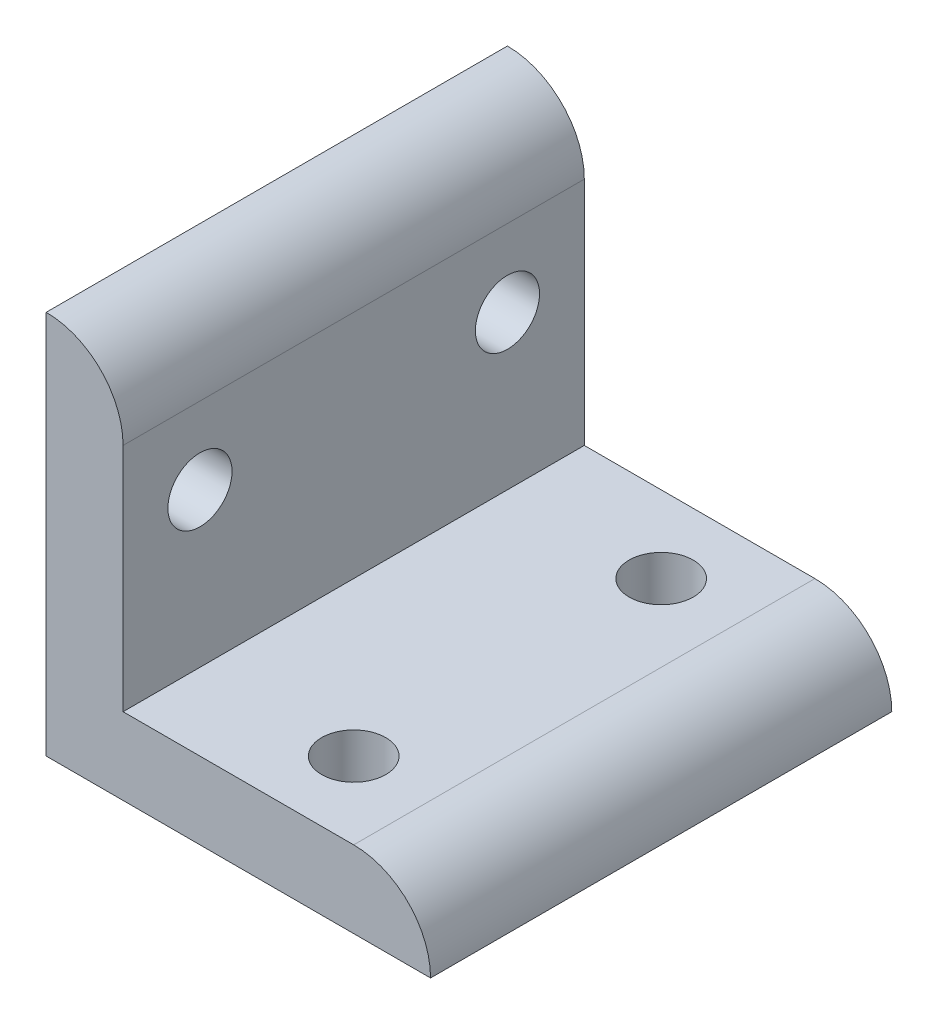
ISO-10303-21;
HEADER;
FILE_DESCRIPTION(('STEP AP214'),'2;1');
FILE_NAME('part.step','',(''),(''),'','','');
FILE_SCHEMA(('AUTOMOTIVE_DESIGN { 1 0 10303 214 1 1 1 1 }'));
ENDSEC;
DATA;
#1=APPLICATION_CONTEXT('core data for automotive mechanical design processes');
#2=APPLICATION_PROTOCOL_DEFINITION('international standard','automotive_design',2000,#1);
#3=PRODUCT_CONTEXT('',#1,'mechanical');
#4=PRODUCT('Part','Part','',(#3));
#5=PRODUCT_RELATED_PRODUCT_CATEGORY('part','',(#4));
#6=PRODUCT_DEFINITION_FORMATION('','',#4);
#7=PRODUCT_DEFINITION_CONTEXT('part definition',#1,'design');
#8=PRODUCT_DEFINITION('design','',#6,#7);
#9=PRODUCT_DEFINITION_SHAPE('','',#8);
#10=(LENGTH_UNIT() NAMED_UNIT(*) SI_UNIT(.MILLI.,.METRE.));
#11=(NAMED_UNIT(*) PLANE_ANGLE_UNIT() SI_UNIT($,.RADIAN.));
#12=(NAMED_UNIT(*) SI_UNIT($,.STERADIAN.) SOLID_ANGLE_UNIT());
#13=UNCERTAINTY_MEASURE_WITH_UNIT(LENGTH_MEASURE(1.E-05),#10,'distance_accuracy_value','');
#14=(GEOMETRIC_REPRESENTATION_CONTEXT(3) GLOBAL_UNCERTAINTY_ASSIGNED_CONTEXT((#13)) GLOBAL_UNIT_ASSIGNED_CONTEXT((#10,
#11,#12)) REPRESENTATION_CONTEXT('',''));
#15=CARTESIAN_POINT('',(0.,0.,0.));
#16=DIRECTION('',(0.,0.,1.));
#17=DIRECTION('',(1.,0.,0.));
#18=AXIS2_PLACEMENT_3D('',#15,#16,#17);
#19=CARTESIAN_POINT('',(6.35,6.35,38.1));
#20=DIRECTION('',(-1.,0.,0.));
#21=DIRECTION('',(0.,-1.,0.));
#22=AXIS2_PLACEMENT_3D('',#19,#20,#21);
#23=PLANE('',#22);
#24=CARTESIAN_POINT('',(6.35,19.05,31.75));
#25=DIRECTION('',(1.,0.,0.));
#26=DIRECTION('',(0.,0.,-1.));
#27=AXIS2_PLACEMENT_3D('',#24,#25,#26);
#28=CIRCLE('',#27,2.65);
#29=CARTESIAN_POINT('',(6.35,19.05,29.1));
#30=VERTEX_POINT('',#29);
#31=EDGE_CURVE('E158',#30,#30,#28,.T.);
#32=ORIENTED_EDGE('',*,*,#31,.F.);
#33=EDGE_LOOP('',(#32));
#34=FACE_BOUND('',#33,.T.);
#35=DIRECTION('',(0.,1.,0.));
#36=VECTOR('',#35,1.);
#37=CARTESIAN_POINT('',(6.35,6.35,0.));
#38=LINE('',#37,#36);
#39=CARTESIAN_POINT('',(6.35,6.35,0.));
#40=VERTEX_POINT('',#39);
#41=CARTESIAN_POINT('',(6.35,25.4,0.));
#42=VERTEX_POINT('',#41);
#43=EDGE_CURVE('E111',#40,#42,#38,.T.);
#44=ORIENTED_EDGE('',*,*,#43,.T.);
#45=DIRECTION('',(0.,0.,-1.));
#46=VECTOR('',#45,1.);
#47=CARTESIAN_POINT('',(6.35,25.4,38.1));
#48=LINE('',#47,#46);
#49=CARTESIAN_POINT('',(6.35,25.4,38.1));
#50=VERTEX_POINT('',#49);
#51=EDGE_CURVE('E11',#42,#50,#48,.F.);
#52=ORIENTED_EDGE('',*,*,#51,.T.);
#53=DIRECTION('',(0.,1.,0.));
#54=VECTOR('',#53,1.);
#55=CARTESIAN_POINT('',(6.35,6.35,38.1));
#56=LINE('',#55,#54);
#57=CARTESIAN_POINT('',(6.35,6.35,38.1));
#58=VERTEX_POINT('',#57);
#59=EDGE_CURVE('E134',#58,#50,#56,.T.);
#60=ORIENTED_EDGE('',*,*,#59,.F.);
#61=DIRECTION('',(0.,0.,-1.));
#62=VECTOR('',#61,1.);
#63=CARTESIAN_POINT('',(6.35,6.35,38.1));
#64=LINE('',#63,#62);
#65=EDGE_CURVE('E119',#58,#40,#64,.T.);
#66=ORIENTED_EDGE('',*,*,#65,.T.);
#67=EDGE_LOOP('',(#44,#52,#60,#66));
#68=FACE_BOUND('',#67,.T.);
#69=CARTESIAN_POINT('',(6.35,19.05,6.35));
#70=DIRECTION('',(1.,0.,0.));
#71=DIRECTION('',(0.,0.,-1.));
#72=AXIS2_PLACEMENT_3D('',#69,#70,#71);
#73=CIRCLE('',#72,2.65);
#74=CARTESIAN_POINT('',(6.35,19.05,3.7));
#75=VERTEX_POINT('',#74);
#76=EDGE_CURVE('E152',#75,#75,#73,.T.);
#77=ORIENTED_EDGE('',*,*,#76,.F.);
#78=EDGE_LOOP('',(#77));
#79=FACE_BOUND('',#78,.T.);
#80=ADVANCED_FACE('F37',(#34,#68,#79),#23,.F.);
#81=CARTESIAN_POINT('',(0.,31.75,38.1));
#82=DIRECTION('',(1.,0.,0.));
#83=DIRECTION('',(0.,1.,0.));
#84=AXIS2_PLACEMENT_3D('',#81,#82,#83);
#85=PLANE('',#84);
#86=CARTESIAN_POINT('',(0.,19.05,31.75));
#87=DIRECTION('',(1.,0.,0.));
#88=DIRECTION('',(0.,1.,0.));
#89=AXIS2_PLACEMENT_3D('',#86,#87,#88);
#90=CIRCLE('',#89,2.65);
#91=CARTESIAN_POINT('',(0.,21.7,31.75));
#92=VERTEX_POINT('',#91);
#93=EDGE_CURVE('E155',#92,#92,#90,.T.);
#94=ORIENTED_EDGE('',*,*,#93,.T.);
#95=EDGE_LOOP('',(#94));
#96=FACE_BOUND('',#95,.T.);
#97=CARTESIAN_POINT('',(0.,19.05,6.35));
#98=DIRECTION('',(1.,0.,0.));
#99=DIRECTION('',(0.,1.,0.));
#100=AXIS2_PLACEMENT_3D('',#97,#98,#99);
#101=CIRCLE('',#100,2.65);
#102=CARTESIAN_POINT('',(0.,21.7,6.35));
#103=VERTEX_POINT('',#102);
#104=EDGE_CURVE('E142',#103,#103,#101,.T.);
#105=ORIENTED_EDGE('',*,*,#104,.T.);
#106=EDGE_LOOP('',(#105));
#107=FACE_BOUND('',#106,.T.);
#108=DIRECTION('',(0.,-1.,0.));
#109=VECTOR('',#108,1.);
#110=CARTESIAN_POINT('',(0.,31.75,0.));
#111=LINE('',#110,#109);
#112=CARTESIAN_POINT('',(0.,31.75,0.));
#113=VERTEX_POINT('',#112);
#114=CARTESIAN_POINT('',(0.,0.,0.));
#115=VERTEX_POINT('',#114);
#116=EDGE_CURVE('E114',#113,#115,#111,.T.);
#117=ORIENTED_EDGE('',*,*,#116,.T.);
#118=DIRECTION('',(0.,0.,-1.));
#119=VECTOR('',#118,1.);
#120=CARTESIAN_POINT('',(0.,0.,38.1));
#121=LINE('',#120,#119);
#122=CARTESIAN_POINT('',(0.,0.,38.1));
#123=VERTEX_POINT('',#122);
#124=EDGE_CURVE('E95',#123,#115,#121,.T.);
#125=ORIENTED_EDGE('',*,*,#124,.F.);
#126=DIRECTION('',(0.,-1.,0.));
#127=VECTOR('',#126,1.);
#128=CARTESIAN_POINT('',(0.,31.75,38.1));
#129=LINE('',#128,#127);
#130=CARTESIAN_POINT('',(0.,31.75,38.1));
#131=VERTEX_POINT('',#130);
#132=EDGE_CURVE('E102',#131,#123,#129,.T.);
#133=ORIENTED_EDGE('',*,*,#132,.F.);
#134=DIRECTION('',(0.,0.,-1.));
#135=VECTOR('',#134,1.);
#136=CARTESIAN_POINT('',(0.,31.75,38.1));
#137=LINE('',#136,#135);
#138=EDGE_CURVE('E147',#131,#113,#137,.T.);
#139=ORIENTED_EDGE('',*,*,#138,.T.);
#140=EDGE_LOOP('',(#117,#125,#133,#139));
#141=FACE_BOUND('',#140,.T.);
#142=ADVANCED_FACE('F113',(#96,#107,#141),#85,.F.);
#143=CARTESIAN_POINT('',(0.,0.,38.1));
#144=DIRECTION('',(0.,1.,0.));
#145=DIRECTION('',(0.,0.,1.));
#146=AXIS2_PLACEMENT_3D('',#143,#144,#145);
#147=PLANE('',#146);
#148=CARTESIAN_POINT('',(19.05,0.,31.75));
#149=DIRECTION('',(0.,1.,0.));
#150=DIRECTION('',(0.,0.,1.));
#151=AXIS2_PLACEMENT_3D('',#148,#149,#150);
#152=CIRCLE('',#151,2.65);
#153=CARTESIAN_POINT('',(19.05,0.,34.4));
#154=VERTEX_POINT('',#153);
#155=EDGE_CURVE('E167',#154,#154,#152,.T.);
#156=ORIENTED_EDGE('',*,*,#155,.T.);
#157=EDGE_LOOP('',(#156));
#158=FACE_BOUND('',#157,.T.);
#159=CARTESIAN_POINT('',(19.05,0.,6.35));
#160=DIRECTION('',(0.,1.,0.));
#161=DIRECTION('',(0.,0.,1.));
#162=AXIS2_PLACEMENT_3D('',#159,#160,#161);
#163=CIRCLE('',#162,2.65);
#164=CARTESIAN_POINT('',(19.05,0.,9.));
#165=VERTEX_POINT('',#164);
#166=EDGE_CURVE('E161',#165,#165,#163,.T.);
#167=ORIENTED_EDGE('',*,*,#166,.T.);
#168=EDGE_LOOP('',(#167));
#169=FACE_BOUND('',#168,.T.);
#170=DIRECTION('',(1.,0.,0.));
#171=VECTOR('',#170,1.);
#172=CARTESIAN_POINT('',(0.,0.,0.));
#173=LINE('',#172,#171);
#174=CARTESIAN_POINT('',(31.75,0.,0.));
#175=VERTEX_POINT('',#174);
#176=EDGE_CURVE('E138',#115,#175,#173,.T.);
#177=ORIENTED_EDGE('',*,*,#176,.T.);
#178=DIRECTION('',(0.,0.,-1.));
#179=VECTOR('',#178,1.);
#180=CARTESIAN_POINT('',(31.75,0.,38.1));
#181=LINE('',#180,#179);
#182=CARTESIAN_POINT('',(31.75,0.,38.1));
#183=VERTEX_POINT('',#182);
#184=EDGE_CURVE('E98',#183,#175,#181,.T.);
#185=ORIENTED_EDGE('',*,*,#184,.F.);
#186=DIRECTION('',(1.,0.,0.));
#187=VECTOR('',#186,1.);
#188=CARTESIAN_POINT('',(0.,0.,38.1));
#189=LINE('',#188,#187);
#190=EDGE_CURVE('E90',#123,#183,#189,.T.);
#191=ORIENTED_EDGE('',*,*,#190,.F.);
#192=ORIENTED_EDGE('',*,*,#124,.T.);
#193=EDGE_LOOP('',(#177,#185,#191,#192));
#194=FACE_BOUND('',#193,.T.);
#195=ADVANCED_FACE('F93',(#158,#169,#194),#147,.F.);
#196=CARTESIAN_POINT('',(31.75,6.35,38.1));
#197=DIRECTION('',(0.,-1.,0.));
#198=DIRECTION('',(1.,0.,0.));
#199=AXIS2_PLACEMENT_3D('',#196,#197,#198);
#200=PLANE('',#199);
#201=CARTESIAN_POINT('',(19.05,6.34999999999998,31.75));
#202=DIRECTION('',(0.,1.,0.));
#203=DIRECTION('',(0.,0.,1.));
#204=AXIS2_PLACEMENT_3D('',#201,#202,#203);
#205=CIRCLE('',#204,2.65);
#206=CARTESIAN_POINT('',(19.05,6.34999999999998,34.4));
#207=VERTEX_POINT('',#206);
#208=EDGE_CURVE('E170',#207,#207,#205,.T.);
#209=ORIENTED_EDGE('',*,*,#208,.F.);
#210=EDGE_LOOP('',(#209));
#211=FACE_BOUND('',#210,.T.);
#212=CARTESIAN_POINT('',(19.05,6.34999999999998,6.35));
#213=DIRECTION('',(0.,1.,0.));
#214=DIRECTION('',(0.,0.,1.));
#215=AXIS2_PLACEMENT_3D('',#212,#213,#214);
#216=CIRCLE('',#215,2.65);
#217=CARTESIAN_POINT('',(19.05,6.34999999999998,9.));
#218=VERTEX_POINT('',#217);
#219=EDGE_CURVE('E164',#218,#218,#216,.T.);
#220=ORIENTED_EDGE('',*,*,#219,.F.);
#221=EDGE_LOOP('',(#220));
#222=FACE_BOUND('',#221,.T.);
#223=DIRECTION('',(-1.,0.,0.));
#224=VECTOR('',#223,1.);
#225=CARTESIAN_POINT('',(31.75,6.35,38.1));
#226=LINE('',#225,#224);
#227=CARTESIAN_POINT('',(25.4,6.35,38.1));
#228=VERTEX_POINT('',#227);
#229=EDGE_CURVE('E101',#228,#58,#226,.T.);
#230=ORIENTED_EDGE('',*,*,#229,.F.);
#231=DIRECTION('',(0.,0.,-1.));
#232=VECTOR('',#231,1.);
#233=CARTESIAN_POINT('',(25.4,6.35,38.1));
#234=LINE('',#233,#232);
#235=CARTESIAN_POINT('',(25.4,6.35,0.));
#236=VERTEX_POINT('',#235);
#237=EDGE_CURVE('E115',#228,#236,#234,.T.);
#238=ORIENTED_EDGE('',*,*,#237,.T.);
#239=DIRECTION('',(-1.,0.,0.));
#240=VECTOR('',#239,1.);
#241=CARTESIAN_POINT('',(31.75,6.35,0.));
#242=LINE('',#241,#240);
#243=EDGE_CURVE('E139',#236,#40,#242,.T.);
#244=ORIENTED_EDGE('',*,*,#243,.T.);
#245=ORIENTED_EDGE('',*,*,#65,.F.);
#246=EDGE_LOOP('',(#230,#238,#244,#245));
#247=FACE_BOUND('',#246,.T.);
#248=ADVANCED_FACE('F131',(#211,#222,#247),#200,.F.);
#249=CARTESIAN_POINT('',(0.,0.,38.1));
#250=DIRECTION('',(0.,0.,1.));
#251=DIRECTION('',(1.,0.,0.));
#252=AXIS2_PLACEMENT_3D('',#249,#250,#251);
#253=PLANE('',#252);
#254=ORIENTED_EDGE('',*,*,#190,.T.);
#255=CARTESIAN_POINT('',(25.4,0.,38.1));
#256=DIRECTION('',(0.,0.,1.));
#257=DIRECTION('',(1.,0.,0.));
#258=AXIS2_PLACEMENT_3D('',#255,#256,#257);
#259=CIRCLE('',#258,6.35);
#260=EDGE_CURVE('E45',#183,#228,#259,.T.);
#261=ORIENTED_EDGE('',*,*,#260,.T.);
#262=ORIENTED_EDGE('',*,*,#229,.T.);
#263=ORIENTED_EDGE('',*,*,#59,.T.);
#264=CARTESIAN_POINT('',(0.,25.4,38.1));
#265=DIRECTION('',(0.,0.,1.));
#266=DIRECTION('',(1.,0.,0.));
#267=AXIS2_PLACEMENT_3D('',#264,#265,#266);
#268=CIRCLE('',#267,6.35);
#269=EDGE_CURVE('E107',#50,#131,#268,.T.);
#270=ORIENTED_EDGE('',*,*,#269,.T.);
#271=ORIENTED_EDGE('',*,*,#132,.T.);
#272=EDGE_LOOP('',(#254,#261,#262,#263,#270,#271));
#273=FACE_BOUND('',#272,.T.);
#274=ADVANCED_FACE('F105',(#273),#253,.T.);
#275=CARTESIAN_POINT('',(0.,0.,0.));
#276=DIRECTION('',(0.,0.,1.));
#277=DIRECTION('',(1.,0.,0.));
#278=AXIS2_PLACEMENT_3D('',#275,#276,#277);
#279=PLANE('',#278);
#280=ORIENTED_EDGE('',*,*,#243,.F.);
#281=CARTESIAN_POINT('',(25.4,0.,0.));
#282=DIRECTION('',(0.,0.,1.));
#283=DIRECTION('',(1.,0.,0.));
#284=AXIS2_PLACEMENT_3D('',#281,#282,#283);
#285=CIRCLE('',#284,6.35);
#286=EDGE_CURVE('E124',#236,#175,#285,.F.);
#287=ORIENTED_EDGE('',*,*,#286,.T.);
#288=ORIENTED_EDGE('',*,*,#176,.F.);
#289=ORIENTED_EDGE('',*,*,#116,.F.);
#290=CARTESIAN_POINT('',(0.,25.4,0.));
#291=DIRECTION('',(0.,0.,1.));
#292=DIRECTION('',(1.,0.,0.));
#293=AXIS2_PLACEMENT_3D('',#290,#291,#292);
#294=CIRCLE('',#293,6.35);
#295=EDGE_CURVE('E58',#113,#42,#294,.F.);
#296=ORIENTED_EDGE('',*,*,#295,.T.);
#297=ORIENTED_EDGE('',*,*,#43,.F.);
#298=EDGE_LOOP('',(#280,#287,#288,#289,#296,#297));
#299=FACE_BOUND('',#298,.T.);
#300=ADVANCED_FACE('F137',(#299),#279,.F.);
#301=CARTESIAN_POINT('',(25.4,0.,38.1));
#302=DIRECTION('',(0.,0.,-1.));
#303=DIRECTION('',(-1.,0.,0.));
#304=AXIS2_PLACEMENT_3D('',#301,#302,#303);
#305=CYLINDRICAL_SURFACE('',#304,6.35);
#306=ORIENTED_EDGE('',*,*,#260,.F.);
#307=ORIENTED_EDGE('',*,*,#184,.T.);
#308=ORIENTED_EDGE('',*,*,#286,.F.);
#309=ORIENTED_EDGE('',*,*,#237,.F.);
#310=EDGE_LOOP('',(#306,#307,#308,#309));
#311=FACE_BOUND('',#310,.T.);
#312=ADVANCED_FACE('F136',(#311),#305,.T.);
#313=CARTESIAN_POINT('',(0.,25.4,38.1));
#314=DIRECTION('',(0.,0.,-1.));
#315=DIRECTION('',(-1.,0.,0.));
#316=AXIS2_PLACEMENT_3D('',#313,#314,#315);
#317=CYLINDRICAL_SURFACE('',#316,6.35);
#318=ORIENTED_EDGE('',*,*,#269,.F.);
#319=ORIENTED_EDGE('',*,*,#51,.F.);
#320=ORIENTED_EDGE('',*,*,#295,.F.);
#321=ORIENTED_EDGE('',*,*,#138,.F.);
#322=EDGE_LOOP('',(#318,#319,#320,#321));
#323=FACE_BOUND('',#322,.T.);
#324=ADVANCED_FACE('F39',(#323),#317,.T.);
#325=CARTESIAN_POINT('',(6.35,19.05,6.35));
#326=DIRECTION('',(1.,0.,0.));
#327=DIRECTION('',(0.,0.,-1.));
#328=AXIS2_PLACEMENT_3D('',#325,#326,#327);
#329=CYLINDRICAL_SURFACE('',#328,2.65);
#330=ORIENTED_EDGE('',*,*,#104,.F.);
#331=EDGE_LOOP('',(#330));
#332=FACE_BOUND('',#331,.T.);
#333=ORIENTED_EDGE('',*,*,#76,.T.);
#334=EDGE_LOOP('',(#333));
#335=FACE_BOUND('',#334,.T.);
#336=ADVANCED_FACE('F192',(#332,#335),#329,.F.);
#337=CARTESIAN_POINT('',(6.35,19.05,31.75));
#338=DIRECTION('',(1.,0.,0.));
#339=DIRECTION('',(0.,0.,-1.));
#340=AXIS2_PLACEMENT_3D('',#337,#338,#339);
#341=CYLINDRICAL_SURFACE('',#340,2.65);
#342=ORIENTED_EDGE('',*,*,#93,.F.);
#343=EDGE_LOOP('',(#342));
#344=FACE_BOUND('',#343,.T.);
#345=ORIENTED_EDGE('',*,*,#31,.T.);
#346=EDGE_LOOP('',(#345));
#347=FACE_BOUND('',#346,.T.);
#348=ADVANCED_FACE('F183',(#344,#347),#341,.F.);
#349=CARTESIAN_POINT('',(19.05,6.34999999999998,6.35));
#350=DIRECTION('',(0.,1.,0.));
#351=DIRECTION('',(0.,0.,1.));
#352=AXIS2_PLACEMENT_3D('',#349,#350,#351);
#353=CYLINDRICAL_SURFACE('',#352,2.65);
#354=ORIENTED_EDGE('',*,*,#166,.F.);
#355=EDGE_LOOP('',(#354));
#356=FACE_BOUND('',#355,.T.);
#357=ORIENTED_EDGE('',*,*,#219,.T.);
#358=EDGE_LOOP('',(#357));
#359=FACE_BOUND('',#358,.T.);
#360=ADVANCED_FACE('F181',(#356,#359),#353,.F.);
#361=CARTESIAN_POINT('',(19.05,6.34999999999998,31.75));
#362=DIRECTION('',(0.,1.,0.));
#363=DIRECTION('',(0.,0.,1.));
#364=AXIS2_PLACEMENT_3D('',#361,#362,#363);
#365=CYLINDRICAL_SURFACE('',#364,2.65);
#366=ORIENTED_EDGE('',*,*,#155,.F.);
#367=EDGE_LOOP('',(#366));
#368=FACE_BOUND('',#367,.T.);
#369=ORIENTED_EDGE('',*,*,#208,.T.);
#370=EDGE_LOOP('',(#369));
#371=FACE_BOUND('',#370,.T.);
#372=ADVANCED_FACE('F174',(#368,#371),#365,.F.);
#373=CLOSED_SHELL('',(#80,#142,#195,#248,#274,#300,#312,#324,#336,#348,#360,#372));
#374=MANIFOLD_SOLID_BREP('B2',#373);
#375=ADVANCED_BREP_SHAPE_REPRESENTATION('',(#18,#374),#14);
#376=SHAPE_DEFINITION_REPRESENTATION(#9,#375);
ENDSEC;
END-ISO-10303-21;
